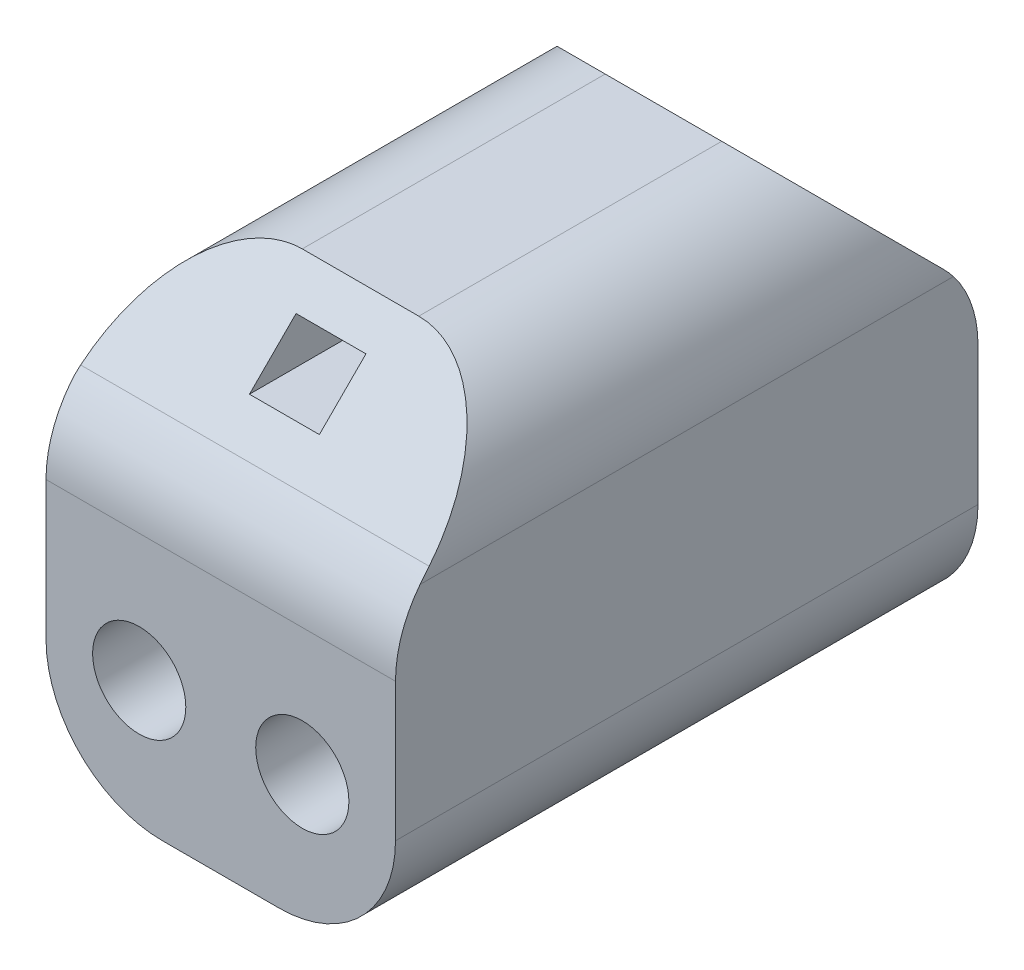
ISO-10303-21;
HEADER;
FILE_DESCRIPTION(('STEP AP214'),'2;1');
FILE_NAME('part.step','',(''),(''),'','','');
FILE_SCHEMA(('AUTOMOTIVE_DESIGN { 1 0 10303 214 1 1 1 1 }'));
ENDSEC;
DATA;
#1=APPLICATION_CONTEXT('core data for automotive mechanical design processes');
#2=APPLICATION_PROTOCOL_DEFINITION('international standard','automotive_design',2000,#1);
#3=PRODUCT_CONTEXT('',#1,'mechanical');
#4=PRODUCT('Part','Part','',(#3));
#5=PRODUCT_RELATED_PRODUCT_CATEGORY('part','',(#4));
#6=PRODUCT_DEFINITION_FORMATION('','',#4);
#7=PRODUCT_DEFINITION_CONTEXT('part definition',#1,'design');
#8=PRODUCT_DEFINITION('design','',#6,#7);
#9=PRODUCT_DEFINITION_SHAPE('','',#8);
#10=(LENGTH_UNIT() NAMED_UNIT(*) SI_UNIT(.MILLI.,.METRE.));
#11=(NAMED_UNIT(*) PLANE_ANGLE_UNIT() SI_UNIT($,.RADIAN.));
#12=(NAMED_UNIT(*) SI_UNIT($,.STERADIAN.) SOLID_ANGLE_UNIT());
#13=UNCERTAINTY_MEASURE_WITH_UNIT(LENGTH_MEASURE(1.E-05),#10,'distance_accuracy_value','');
#14=(GEOMETRIC_REPRESENTATION_CONTEXT(3) GLOBAL_UNCERTAINTY_ASSIGNED_CONTEXT((#13)) GLOBAL_UNIT_ASSIGNED_CONTEXT((#10,
#11,#12)) REPRESENTATION_CONTEXT('',''));
#15=CARTESIAN_POINT('',(0.,0.,0.));
#16=DIRECTION('',(0.,0.,1.));
#17=DIRECTION('',(1.,0.,0.));
#18=AXIS2_PLACEMENT_3D('',#15,#16,#17);
#19=CARTESIAN_POINT('',(7.5,-10.2167347703134,18.3243699615133));
#20=DIRECTION('',(0.,-1.,0.));
#21=DIRECTION('',(0.,0.,-1.));
#22=AXIS2_PLACEMENT_3D('',#19,#20,#21);
#23=PLANE('',#22);
#24=DIRECTION('',(-1.,0.,0.));
#25=VECTOR('',#24,1.);
#26=CARTESIAN_POINT('',(7.5,-10.2167347703134,31.3243699615132));
#27=LINE('',#26,#25);
#28=CARTESIAN_POINT('',(2.5,-10.2167347703134,31.3243699615132));
#29=VERTEX_POINT('',#28);
#30=CARTESIAN_POINT('',(-2.5,-10.2167347703134,31.3243699615132));
#31=VERTEX_POINT('',#30);
#32=EDGE_CURVE('E297',#29,#31,#27,.T.);
#33=ORIENTED_EDGE('',*,*,#32,.F.);
#34=DIRECTION('',(0.,0.,1.));
#35=VECTOR('',#34,1.);
#36=CARTESIAN_POINT('',(2.5,-10.2167347703134,18.3243699615133));
#37=LINE('',#36,#35);
#38=CARTESIAN_POINT('',(2.5,-10.2167347703134,18.3243699615133));
#39=VERTEX_POINT('',#38);
#40=EDGE_CURVE('E303',#29,#39,#37,.F.);
#41=ORIENTED_EDGE('',*,*,#40,.T.);
#42=DIRECTION('',(-1.,0.,0.));
#43=VECTOR('',#42,1.);
#44=CARTESIAN_POINT('',(7.5,-10.2167347703134,18.3243699615133));
#45=LINE('',#44,#43);
#46=CARTESIAN_POINT('',(-2.5,-10.2167347703134,18.3243699615133));
#47=VERTEX_POINT('',#46);
#48=EDGE_CURVE('E327',#39,#47,#45,.T.);
#49=ORIENTED_EDGE('',*,*,#48,.T.);
#50=DIRECTION('',(0.,0.,1.));
#51=VECTOR('',#50,1.);
#52=CARTESIAN_POINT('',(-2.5,-10.2167347703134,18.3243699615133));
#53=LINE('',#52,#51);
#54=EDGE_CURVE('E306',#47,#31,#53,.T.);
#55=ORIENTED_EDGE('',*,*,#54,.T.);
#56=EDGE_LOOP('',(#33,#41,#49,#55));
#57=FACE_BOUND('',#56,.T.);
#58=ADVANCED_FACE('F42',(#57),#23,.F.);
#59=CARTESIAN_POINT('',(7.5,-10.2167347703134,31.3243699615132));
#60=DIRECTION('',(0.,-0.707106781186552,-0.707106781186543));
#61=DIRECTION('',(0.,0.707106781186543,-0.707106781186552));
#62=AXIS2_PLACEMENT_3D('',#59,#60,#61);
#63=PLANE('',#62);
#64=DIRECTION('',(1.,0.,0.));
#65=VECTOR('',#64,1.);
#66=CARTESIAN_POINT('',(7.5,-11.4845017232798,32.5921369144796));
#67=LINE('',#66,#65);
#68=CARTESIAN_POINT('',(-1.5,-11.4845017232798,32.5921369144796));
#69=VERTEX_POINT('',#68);
#70=CARTESIAN_POINT('',(1.5,-11.4845017232798,32.5921369144796));
#71=VERTEX_POINT('',#70);
#72=EDGE_CURVE('E185',#69,#71,#67,.T.);
#73=ORIENTED_EDGE('',*,*,#72,.T.);
#74=DIRECTION('',(0.,-0.707106781186543,0.707106781186552));
#75=VECTOR('',#74,1.);
#76=CARTESIAN_POINT('',(1.5,-10.2167347703134,31.3243699615132));
#77=LINE('',#76,#75);
#78=CARTESIAN_POINT('',(1.5,-13.4845017232798,34.5921369144796));
#79=VERTEX_POINT('',#78);
#80=EDGE_CURVE('E177',#71,#79,#77,.T.);
#81=ORIENTED_EDGE('',*,*,#80,.T.);
#82=DIRECTION('',(-1.,0.,0.));
#83=VECTOR('',#82,1.);
#84=CARTESIAN_POINT('',(7.5,-13.4845017232798,34.5921369144796));
#85=LINE('',#84,#83);
#86=CARTESIAN_POINT('',(-1.5,-13.4845017232797,34.5921369144796));
#87=VERTEX_POINT('',#86);
#88=EDGE_CURVE('E380',#79,#87,#85,.T.);
#89=ORIENTED_EDGE('',*,*,#88,.T.);
#90=DIRECTION('',(0.,0.707106781186543,-0.707106781186552));
#91=VECTOR('',#90,1.);
#92=CARTESIAN_POINT('',(-1.5,-10.2167347703134,31.3243699615132));
#93=LINE('',#92,#91);
#94=EDGE_CURVE('E365',#87,#69,#93,.T.);
#95=ORIENTED_EDGE('',*,*,#94,.T.);
#96=EDGE_LOOP('',(#73,#81,#89,#95));
#97=FACE_BOUND('',#96,.T.);
#98=DIRECTION('',(-1.,0.,0.));
#99=VECTOR('',#98,1.);
#100=CARTESIAN_POINT('',(7.5,-14.7522686762461,35.859903867446));
#101=LINE('',#100,#99);
#102=CARTESIAN_POINT('',(-7.47838038396644,-14.7522686762461,35.859903867446));
#103=VERTEX_POINT('',#102);
#104=CARTESIAN_POINT('',(7.47838038396645,-14.7522686762461,35.859903867446));
#105=VERTEX_POINT('',#104);
#106=EDGE_CURVE('E347',#103,#105,#101,.F.);
#107=ORIENTED_EDGE('',*,*,#106,.T.);
#108=CARTESIAN_POINT('',(2.5,-15.2167347703134,36.3243699615132));
#109=DIRECTION('',(0.,-0.707106781186552,-0.707106781186543));
#110=DIRECTION('',(0.,0.707106781186543,-0.707106781186552));
#111=AXIS2_PLACEMENT_3D('',#108,#109,#110);
#112=ELLIPSE('',#111,7.07106781186552,5.);
#113=EDGE_CURVE('E313',#105,#29,#112,.F.);
#114=ORIENTED_EDGE('',*,*,#113,.T.);
#115=ORIENTED_EDGE('',*,*,#32,.T.);
#116=CARTESIAN_POINT('',(-2.5,-15.2167347703134,36.3243699615132));
#117=DIRECTION('',(0.,-0.707106781186552,-0.707106781186543));
#118=DIRECTION('',(0.,-0.707106781186543,0.707106781186552));
#119=AXIS2_PLACEMENT_3D('',#116,#117,#118);
#120=ELLIPSE('',#119,7.07106781186552,5.);
#121=EDGE_CURVE('E417',#31,#103,#120,.F.);
#122=ORIENTED_EDGE('',*,*,#121,.T.);
#123=EDGE_LOOP('',(#107,#114,#115,#122));
#124=FACE_BOUND('',#123,.T.);
#125=ADVANCED_FACE('F289',(#97,#124),#63,.F.);
#126=CARTESIAN_POINT('',(7.5,-16.2167347703134,37.3243699615132));
#127=DIRECTION('',(0.,0.,-1.));
#128=DIRECTION('',(-1.,0.,0.));
#129=AXIS2_PLACEMENT_3D('',#126,#127,#128);
#130=PLANE('',#129);
#131=CARTESIAN_POINT('',(3.5,-23.7522686762461,37.3243699615133));
#132=DIRECTION('',(0.,0.,-1.));
#133=DIRECTION('',(-1.,0.,0.));
#134=AXIS2_PLACEMENT_3D('',#131,#132,#133);
#135=CIRCLE('',#134,2.);
#136=CARTESIAN_POINT('',(1.5,-23.7522686762461,37.3243699615133));
#137=VERTEX_POINT('',#136);
#138=EDGE_CURVE('E207',#137,#137,#135,.T.);
#139=ORIENTED_EDGE('',*,*,#138,.T.);
#140=EDGE_LOOP('',(#139));
#141=FACE_BOUND('',#140,.T.);
#142=CARTESIAN_POINT('',(-3.5,-23.7522686762461,37.3243699615133));
#143=DIRECTION('',(0.,0.,-1.));
#144=DIRECTION('',(-1.,0.,0.));
#145=AXIS2_PLACEMENT_3D('',#142,#143,#144);
#146=CIRCLE('',#145,2.);
#147=CARTESIAN_POINT('',(-5.5,-23.7522686762461,37.3243699615133));
#148=VERTEX_POINT('',#147);
#149=EDGE_CURVE('E205',#148,#148,#146,.T.);
#150=ORIENTED_EDGE('',*,*,#149,.T.);
#151=EDGE_LOOP('',(#150));
#152=FACE_BOUND('',#151,.T.);
#153=DIRECTION('',(0.,-1.,0.));
#154=VECTOR('',#153,1.);
#155=CARTESIAN_POINT('',(-7.5,-16.2167347703134,37.3243699615132));
#156=LINE('',#155,#154);
#157=CARTESIAN_POINT('',(-7.5,-18.2878025821789,37.3243699615132));
#158=VERTEX_POINT('',#157);
#159=CARTESIAN_POINT('',(-7.5,-24.2167347703134,37.3243699615132));
#160=VERTEX_POINT('',#159);
#161=EDGE_CURVE('E387',#158,#160,#156,.T.);
#162=ORIENTED_EDGE('',*,*,#161,.T.);
#163=CARTESIAN_POINT('',(-2.5,-24.2167347703134,37.3243699615132));
#164=DIRECTION('',(0.,0.,-1.));
#165=DIRECTION('',(-1.,0.,0.));
#166=AXIS2_PLACEMENT_3D('',#163,#164,#165);
#167=CIRCLE('',#166,5.);
#168=CARTESIAN_POINT('',(-2.5,-29.2167347703134,37.3243699615132));
#169=VERTEX_POINT('',#168);
#170=EDGE_CURVE('E221',#160,#169,#167,.F.);
#171=ORIENTED_EDGE('',*,*,#170,.T.);
#172=DIRECTION('',(-1.,0.,0.));
#173=VECTOR('',#172,1.);
#174=CARTESIAN_POINT('',(7.5,-29.2167347703134,37.3243699615132));
#175=LINE('',#174,#173);
#176=CARTESIAN_POINT('',(2.5,-29.2167347703134,37.3243699615132));
#177=VERTEX_POINT('',#176);
#178=EDGE_CURVE('E309',#177,#169,#175,.T.);
#179=ORIENTED_EDGE('',*,*,#178,.F.);
#180=CARTESIAN_POINT('',(2.5,-24.2167347703134,37.3243699615132));
#181=DIRECTION('',(0.,0.,-1.));
#182=DIRECTION('',(-1.,0.,0.));
#183=AXIS2_PLACEMENT_3D('',#180,#181,#182);
#184=CIRCLE('',#183,5.);
#185=CARTESIAN_POINT('',(7.5,-24.2167347703134,37.3243699615132));
#186=VERTEX_POINT('',#185);
#187=EDGE_CURVE('E219',#177,#186,#184,.F.);
#188=ORIENTED_EDGE('',*,*,#187,.T.);
#189=DIRECTION('',(0.,-1.,0.));
#190=VECTOR('',#189,1.);
#191=CARTESIAN_POINT('',(7.5,-16.2167347703134,37.3243699615132));
#192=LINE('',#191,#190);
#193=CARTESIAN_POINT('',(7.5,-18.2878025821789,37.3243699615132));
#194=VERTEX_POINT('',#193);
#195=EDGE_CURVE('E388',#194,#186,#192,.T.);
#196=ORIENTED_EDGE('',*,*,#195,.F.);
#197=DIRECTION('',(-1.,0.,0.));
#198=VECTOR('',#197,1.);
#199=CARTESIAN_POINT('',(7.5,-18.2878025821789,37.3243699615132));
#200=LINE('',#199,#198);
#201=EDGE_CURVE('E307',#194,#158,#200,.T.);
#202=ORIENTED_EDGE('',*,*,#201,.T.);
#203=EDGE_LOOP('',(#162,#171,#179,#188,#196,#202));
#204=FACE_BOUND('',#203,.T.);
#205=ADVANCED_FACE('F294',(#141,#152,#204),#130,.F.);
#206=CARTESIAN_POINT('',(7.5,-29.2167347703134,37.3243699615132));
#207=DIRECTION('',(0.,1.,0.));
#208=DIRECTION('',(0.,0.,1.));
#209=AXIS2_PLACEMENT_3D('',#206,#207,#208);
#210=PLANE('',#209);
#211=ORIENTED_EDGE('',*,*,#178,.T.);
#212=DIRECTION('',(0.,0.,-1.));
#213=VECTOR('',#212,1.);
#214=CARTESIAN_POINT('',(-2.5,-29.2167347703134,37.3243699615132));
#215=LINE('',#214,#213);
#216=CARTESIAN_POINT('',(-2.5,-29.2167347703134,12.3243699615132));
#217=VERTEX_POINT('',#216);
#218=EDGE_CURVE('E192',#169,#217,#215,.T.);
#219=ORIENTED_EDGE('',*,*,#218,.T.);
#220=DIRECTION('',(-1.,0.,0.));
#221=VECTOR('',#220,1.);
#222=CARTESIAN_POINT('',(7.5,-29.2167347703134,12.3243699615132));
#223=LINE('',#222,#221);
#224=CARTESIAN_POINT('',(2.5,-29.2167347703134,12.3243699615132));
#225=VERTEX_POINT('',#224);
#226=EDGE_CURVE('E404',#225,#217,#223,.T.);
#227=ORIENTED_EDGE('',*,*,#226,.F.);
#228=DIRECTION('',(0.,0.,-1.));
#229=VECTOR('',#228,1.);
#230=CARTESIAN_POINT('',(2.5,-29.2167347703134,37.3243699615132));
#231=LINE('',#230,#229);
#232=EDGE_CURVE('E186',#225,#177,#231,.F.);
#233=ORIENTED_EDGE('',*,*,#232,.T.);
#234=EDGE_LOOP('',(#211,#219,#227,#233));
#235=FACE_BOUND('',#234,.T.);
#236=ADVANCED_FACE('F484',(#235),#210,.F.);
#237=CARTESIAN_POINT('',(7.5,-29.2167347703134,12.3243699615132));
#238=DIRECTION('',(0.,0.,1.));
#239=DIRECTION('',(1.,0.,0.));
#240=AXIS2_PLACEMENT_3D('',#237,#238,#239);
#241=PLANE('',#240);
#242=CARTESIAN_POINT('',(3.5,-23.7522686762461,12.3243699615132));
#243=DIRECTION('',(0.,0.,1.));
#244=DIRECTION('',(1.,0.,0.));
#245=AXIS2_PLACEMENT_3D('',#242,#243,#244);
#246=CIRCLE('',#245,2.);
#247=CARTESIAN_POINT('',(5.5,-23.7522686762461,12.3243699615132));
#248=VERTEX_POINT('',#247);
#249=EDGE_CURVE('E201',#248,#248,#246,.T.);
#250=ORIENTED_EDGE('',*,*,#249,.T.);
#251=EDGE_LOOP('',(#250));
#252=FACE_BOUND('',#251,.T.);
#253=CARTESIAN_POINT('',(-3.5,-23.7522686762461,12.3243699615132));
#254=DIRECTION('',(0.,0.,1.));
#255=DIRECTION('',(1.,0.,0.));
#256=AXIS2_PLACEMENT_3D('',#253,#254,#255);
#257=CIRCLE('',#256,2.);
#258=CARTESIAN_POINT('',(-1.5,-23.7522686762461,12.3243699615132));
#259=VERTEX_POINT('',#258);
#260=EDGE_CURVE('E198',#259,#259,#257,.T.);
#261=ORIENTED_EDGE('',*,*,#260,.T.);
#262=EDGE_LOOP('',(#261));
#263=FACE_BOUND('',#262,.T.);
#264=ORIENTED_EDGE('',*,*,#226,.T.);
#265=CARTESIAN_POINT('',(-2.5,-24.2167347703134,12.3243699615132));
#266=DIRECTION('',(0.,0.,1.));
#267=DIRECTION('',(1.,0.,0.));
#268=AXIS2_PLACEMENT_3D('',#265,#266,#267);
#269=CIRCLE('',#268,5.);
#270=CARTESIAN_POINT('',(-7.5,-24.2167347703134,12.3243699615132));
#271=VERTEX_POINT('',#270);
#272=EDGE_CURVE('E213',#217,#271,#269,.F.);
#273=ORIENTED_EDGE('',*,*,#272,.T.);
#274=DIRECTION('',(0.,1.,0.));
#275=VECTOR('',#274,1.);
#276=CARTESIAN_POINT('',(-7.5,-29.2167347703134,12.3243699615132));
#277=LINE('',#276,#275);
#278=CARTESIAN_POINT('',(-7.5,-18.2878025821789,12.3243699615132));
#279=VERTEX_POINT('',#278);
#280=EDGE_CURVE('E393',#271,#279,#277,.T.);
#281=ORIENTED_EDGE('',*,*,#280,.T.);
#282=DIRECTION('',(-1.,0.,0.));
#283=VECTOR('',#282,1.);
#284=CARTESIAN_POINT('',(7.5,-18.2878025821789,12.3243699615132));
#285=LINE('',#284,#283);
#286=CARTESIAN_POINT('',(7.5,-18.2878025821789,12.3243699615132));
#287=VERTEX_POINT('',#286);
#288=EDGE_CURVE('E171',#279,#287,#285,.F.);
#289=ORIENTED_EDGE('',*,*,#288,.T.);
#290=DIRECTION('',(0.,1.,0.));
#291=VECTOR('',#290,1.);
#292=CARTESIAN_POINT('',(7.5,-29.2167347703134,12.3243699615132));
#293=LINE('',#292,#291);
#294=CARTESIAN_POINT('',(7.5,-24.2167347703134,12.3243699615132));
#295=VERTEX_POINT('',#294);
#296=EDGE_CURVE('E395',#295,#287,#293,.T.);
#297=ORIENTED_EDGE('',*,*,#296,.F.);
#298=CARTESIAN_POINT('',(2.5,-24.2167347703134,12.3243699615132));
#299=DIRECTION('',(0.,0.,1.));
#300=DIRECTION('',(1.,0.,0.));
#301=AXIS2_PLACEMENT_3D('',#298,#299,#300);
#302=CIRCLE('',#301,5.);
#303=EDGE_CURVE('E211',#295,#225,#302,.F.);
#304=ORIENTED_EDGE('',*,*,#303,.T.);
#305=EDGE_LOOP('',(#264,#273,#281,#289,#297,#304));
#306=FACE_BOUND('',#305,.T.);
#307=ADVANCED_FACE('F462',(#252,#263,#306),#241,.F.);
#308=CARTESIAN_POINT('',(7.5,-16.2167347703134,12.3243699615132));
#309=DIRECTION('',(0.,-0.707106781186552,0.707106781186543));
#310=DIRECTION('',(0.,-0.707106781186543,-0.707106781186552));
#311=AXIS2_PLACEMENT_3D('',#308,#309,#310);
#312=PLANE('',#311);
#313=DIRECTION('',(1.,0.,0.));
#314=VECTOR('',#313,1.);
#315=CARTESIAN_POINT('',(7.5,-13.4845017232798,15.0566030085469));
#316=LINE('',#315,#314);
#317=CARTESIAN_POINT('',(-1.5,-13.4845017232798,15.0566030085469));
#318=VERTEX_POINT('',#317);
#319=CARTESIAN_POINT('',(1.5,-13.4845017232798,15.0566030085469));
#320=VERTEX_POINT('',#319);
#321=EDGE_CURVE('E190',#318,#320,#316,.T.);
#322=ORIENTED_EDGE('',*,*,#321,.T.);
#323=DIRECTION('',(0.,0.707106781186543,0.707106781186552));
#324=VECTOR('',#323,1.);
#325=CARTESIAN_POINT('',(1.5,-16.2167347703134,12.3243699615132));
#326=LINE('',#325,#324);
#327=CARTESIAN_POINT('',(1.5,-11.4845017232798,17.0566030085469));
#328=VERTEX_POINT('',#327);
#329=EDGE_CURVE('E176',#320,#328,#326,.T.);
#330=ORIENTED_EDGE('',*,*,#329,.T.);
#331=DIRECTION('',(-1.,0.,0.));
#332=VECTOR('',#331,1.);
#333=CARTESIAN_POINT('',(7.5,-11.4845017232798,17.0566030085469));
#334=LINE('',#333,#332);
#335=CARTESIAN_POINT('',(-1.5,-11.4845017232798,17.0566030085469));
#336=VERTEX_POINT('',#335);
#337=EDGE_CURVE('E156',#328,#336,#334,.T.);
#338=ORIENTED_EDGE('',*,*,#337,.T.);
#339=DIRECTION('',(0.,-0.707106781186543,-0.707106781186552));
#340=VECTOR('',#339,1.);
#341=CARTESIAN_POINT('',(-1.5,-16.2167347703134,12.3243699615132));
#342=LINE('',#341,#340);
#343=EDGE_CURVE('E167',#336,#318,#342,.T.);
#344=ORIENTED_EDGE('',*,*,#343,.T.);
#345=EDGE_LOOP('',(#322,#330,#338,#344));
#346=FACE_BOUND('',#345,.T.);
#347=ORIENTED_EDGE('',*,*,#48,.F.);
#348=CARTESIAN_POINT('',(2.5,-15.2167347703134,13.3243699615133));
#349=DIRECTION('',(0.,-0.707106781186552,0.707106781186543));
#350=DIRECTION('',(0.,-0.707106781186543,-0.707106781186552));
#351=AXIS2_PLACEMENT_3D('',#348,#349,#350);
#352=ELLIPSE('',#351,7.07106781186552,5.);
#353=CARTESIAN_POINT('',(7.47838038396645,-14.7522686762461,13.7888360555805));
#354=VERTEX_POINT('',#353);
#355=EDGE_CURVE('E317',#39,#354,#352,.F.);
#356=ORIENTED_EDGE('',*,*,#355,.T.);
#357=DIRECTION('',(-1.,0.,0.));
#358=VECTOR('',#357,1.);
#359=CARTESIAN_POINT('',(7.5,-14.7522686762461,13.7888360555805));
#360=LINE('',#359,#358);
#361=CARTESIAN_POINT('',(-7.47838038396644,-14.7522686762461,13.7888360555805));
#362=VERTEX_POINT('',#361);
#363=EDGE_CURVE('E330',#354,#362,#360,.T.);
#364=ORIENTED_EDGE('',*,*,#363,.T.);
#365=CARTESIAN_POINT('',(-2.5,-15.2167347703134,13.3243699615133));
#366=DIRECTION('',(0.,-0.707106781186552,0.707106781186543));
#367=DIRECTION('',(0.,0.707106781186543,0.707106781186552));
#368=AXIS2_PLACEMENT_3D('',#365,#366,#367);
#369=ELLIPSE('',#368,7.07106781186552,5.);
#370=EDGE_CURVE('E319',#362,#47,#369,.F.);
#371=ORIENTED_EDGE('',*,*,#370,.T.);
#372=EDGE_LOOP('',(#347,#356,#364,#371));
#373=FACE_BOUND('',#372,.T.);
#374=ADVANCED_FACE('F184',(#346,#373),#312,.F.);
#375=CARTESIAN_POINT('',(7.5,0.,0.));
#376=DIRECTION('',(1.,0.,0.));
#377=DIRECTION('',(0.,0.,-1.));
#378=AXIS2_PLACEMENT_3D('',#375,#376,#377);
#379=PLANE('',#378);
#380=CARTESIAN_POINT('',(7.5,-18.2878025821789,17.3243699615132));
#381=DIRECTION('',(1.,0.,0.));
#382=DIRECTION('',(0.,0.,-1.));
#383=AXIS2_PLACEMENT_3D('',#380,#381,#382);
#384=CIRCLE('',#383,5.);
#385=CARTESIAN_POINT('',(7.5,-15.2167347703134,13.3786707212107));
#386=VERTEX_POINT('',#385);
#387=EDGE_CURVE('E341',#287,#386,#384,.T.);
#388=ORIENTED_EDGE('',*,*,#387,.T.);
#389=DIRECTION('',(0.,0.,1.));
#390=VECTOR('',#389,1.);
#391=CARTESIAN_POINT('',(7.5,-15.2167347703134,31.3243699615132));
#392=LINE('',#391,#390);
#393=CARTESIAN_POINT('',(7.5,-15.2167347703134,36.2700692018157));
#394=VERTEX_POINT('',#393);
#395=EDGE_CURVE('E229',#386,#394,#392,.T.);
#396=ORIENTED_EDGE('',*,*,#395,.T.);
#397=CARTESIAN_POINT('',(7.5,-18.2878025821789,32.3243699615132));
#398=DIRECTION('',(1.,0.,0.));
#399=DIRECTION('',(0.,0.,-1.));
#400=AXIS2_PLACEMENT_3D('',#397,#398,#399);
#401=CIRCLE('',#400,5.);
#402=EDGE_CURVE('E331',#394,#194,#401,.T.);
#403=ORIENTED_EDGE('',*,*,#402,.T.);
#404=ORIENTED_EDGE('',*,*,#195,.T.);
#405=DIRECTION('',(0.,0.,-1.));
#406=VECTOR('',#405,1.);
#407=CARTESIAN_POINT('',(7.5,-24.2167347703134,12.3243699615132));
#408=LINE('',#407,#406);
#409=EDGE_CURVE('E228',#186,#295,#408,.T.);
#410=ORIENTED_EDGE('',*,*,#409,.T.);
#411=ORIENTED_EDGE('',*,*,#296,.T.);
#412=EDGE_LOOP('',(#388,#396,#403,#404,#410,#411));
#413=FACE_BOUND('',#412,.T.);
#414=ADVANCED_FACE('F336',(#413),#379,.T.);
#415=CARTESIAN_POINT('',(-7.5,0.,0.));
#416=DIRECTION('',(1.,0.,0.));
#417=DIRECTION('',(0.,0.,-1.));
#418=AXIS2_PLACEMENT_3D('',#415,#416,#417);
#419=PLANE('',#418);
#420=CARTESIAN_POINT('',(-7.5,-18.2878025821789,32.3243699615132));
#421=DIRECTION('',(1.,0.,0.));
#422=DIRECTION('',(0.,0.,-1.));
#423=AXIS2_PLACEMENT_3D('',#420,#421,#422);
#424=CIRCLE('',#423,5.);
#425=CARTESIAN_POINT('',(-7.5,-15.2167347703134,36.2700692018157));
#426=VERTEX_POINT('',#425);
#427=EDGE_CURVE('E418',#158,#426,#424,.F.);
#428=ORIENTED_EDGE('',*,*,#427,.T.);
#429=DIRECTION('',(0.,0.,1.));
#430=VECTOR('',#429,1.);
#431=CARTESIAN_POINT('',(-7.5,-15.2167347703134,0.));
#432=LINE('',#431,#430);
#433=CARTESIAN_POINT('',(-7.5,-15.2167347703134,13.3786707212107));
#434=VERTEX_POINT('',#433);
#435=EDGE_CURVE('E11',#426,#434,#432,.F.);
#436=ORIENTED_EDGE('',*,*,#435,.T.);
#437=CARTESIAN_POINT('',(-7.5,-18.2878025821789,17.3243699615132));
#438=DIRECTION('',(1.,0.,0.));
#439=DIRECTION('',(0.,0.,-1.));
#440=AXIS2_PLACEMENT_3D('',#437,#438,#439);
#441=CIRCLE('',#440,5.);
#442=EDGE_CURVE('E413',#434,#279,#441,.F.);
#443=ORIENTED_EDGE('',*,*,#442,.T.);
#444=ORIENTED_EDGE('',*,*,#280,.F.);
#445=DIRECTION('',(0.,0.,-1.));
#446=VECTOR('',#445,1.);
#447=CARTESIAN_POINT('',(-7.5,-24.2167347703134,0.));
#448=LINE('',#447,#446);
#449=EDGE_CURVE('E220',#271,#160,#448,.F.);
#450=ORIENTED_EDGE('',*,*,#449,.T.);
#451=ORIENTED_EDGE('',*,*,#161,.F.);
#452=EDGE_LOOP('',(#428,#436,#443,#444,#450,#451));
#453=FACE_BOUND('',#452,.T.);
#454=ADVANCED_FACE('F251',(#453),#419,.F.);
#455=CARTESIAN_POINT('',(7.5,-18.2878025821789,32.3243699615132));
#456=DIRECTION('',(-1.,0.,0.));
#457=DIRECTION('',(0.,0.,1.));
#458=AXIS2_PLACEMENT_3D('',#455,#456,#457);
#459=CYLINDRICAL_SURFACE('',#458,5.);
#460=ORIENTED_EDGE('',*,*,#402,.F.);
#461=CARTESIAN_POINT('',(7.5,-15.2167347703134,36.2700692018157));
#462=CARTESIAN_POINT('',(7.50000022228035,-15.1759009062012,36.2382875819391));
#463=CARTESIAN_POINT('',(7.49949979039581,-15.135562259342,36.2058721017981));
#464=CARTESIAN_POINT('',(7.49757314974649,-15.0559720970149,36.1398568381183));
#465=CARTESIAN_POINT('',(7.49614808047301,-15.0167193053733,36.1062585603531));
#466=CARTESIAN_POINT('',(7.49244735306524,-14.9392973421894,36.0378831443199));
#467=CARTESIAN_POINT('',(7.49017170544814,-14.9011281572548,36.0031060206328));
#468=CARTESIAN_POINT('',(7.48484176544979,-14.8258668557712,35.9323711010083));
#469=CARTESIAN_POINT('',(7.48178651759004,-14.7887761235624,35.8964119037751));
#470=CARTESIAN_POINT('',(7.47838038396645,-14.7522686762461,35.859903867446));
#471=B_SPLINE_CURVE_WITH_KNOTS('',3,(#461,#462,#463,#464,#465,#466,#467,#468,#469,#470),
.UNSPECIFIED.,.F.,.F.,(4,2,2,2,4),(0.,0.155222217477744,0.310253506834467,0.46528287932795,
0.620503176248766),.UNSPECIFIED.);
#472=EDGE_CURVE('E245',#394,#105,#471,.T.);
#473=ORIENTED_EDGE('',*,*,#472,.T.);
#474=ORIENTED_EDGE('',*,*,#106,.F.);
#475=CARTESIAN_POINT('',(-7.47838038396644,-14.7522686762461,35.859903867446));
#476=CARTESIAN_POINT('',(-7.48178651759004,-14.7887761235624,35.8964119037751));
#477=CARTESIAN_POINT('',(-7.48484176544979,-14.8258668557712,35.9323711010083));
#478=CARTESIAN_POINT('',(-7.49017170544814,-14.9011281572548,36.0031060206328));
#479=CARTESIAN_POINT('',(-7.49244735306523,-14.9392973421894,36.0378831443199));
#480=CARTESIAN_POINT('',(-7.49614808047301,-15.0167193053733,36.1062585603531));
#481=CARTESIAN_POINT('',(-7.49757314974649,-15.0559720970149,36.1398568381183));
#482=CARTESIAN_POINT('',(-7.4994997903958,-15.135562259342,36.2058721017981));
#483=CARTESIAN_POINT('',(-7.50000022228035,-15.1759009062012,36.2382875819391));
#484=CARTESIAN_POINT('',(-7.5,-15.2167347703134,36.2700692018157));
#485=B_SPLINE_CURVE_WITH_KNOTS('',3,(#475,#476,#477,#478,#479,#480,#481,#482,#483,#484),
.UNSPECIFIED.,.F.,.F.,(4,2,2,2,4),(0.,0.155220296920817,0.3102496694143,0.465280958771023,
0.620503176248769),.UNSPECIFIED.);
#486=EDGE_CURVE('E234',#103,#426,#485,.T.);
#487=ORIENTED_EDGE('',*,*,#486,.T.);
#488=ORIENTED_EDGE('',*,*,#427,.F.);
#489=ORIENTED_EDGE('',*,*,#201,.F.);
#490=EDGE_LOOP('',(#460,#473,#474,#487,#488,#489));
#491=FACE_BOUND('',#490,.T.);
#492=ADVANCED_FACE('F247',(#491),#459,.T.);
#493=CARTESIAN_POINT('',(7.5,-18.2878025821789,17.3243699615132));
#494=DIRECTION('',(-1.,0.,0.));
#495=DIRECTION('',(0.,0.,1.));
#496=AXIS2_PLACEMENT_3D('',#493,#494,#495);
#497=CYLINDRICAL_SURFACE('',#496,5.);
#498=ORIENTED_EDGE('',*,*,#363,.F.);
#499=CARTESIAN_POINT('',(7.47838038396645,-14.7522686762461,13.7888360555805));
#500=CARTESIAN_POINT('',(7.48178651759004,-14.7887761235624,13.7523280192514));
#501=CARTESIAN_POINT('',(7.48484176544979,-14.8258668557712,13.7163688220182));
#502=CARTESIAN_POINT('',(7.49017170544814,-14.9011281572548,13.6456339023937));
#503=CARTESIAN_POINT('',(7.49244735306524,-14.9392973421894,13.6108567787066));
#504=CARTESIAN_POINT('',(7.49614808047301,-15.0167193053733,13.5424813626734));
#505=CARTESIAN_POINT('',(7.49757314974649,-15.0559720970149,13.5088830849081));
#506=CARTESIAN_POINT('',(7.4994997903958,-15.135562259342,13.4428678212284));
#507=CARTESIAN_POINT('',(7.50000022228035,-15.1759009062012,13.4104523410874));
#508=CARTESIAN_POINT('',(7.5,-15.2167347703134,13.3786707212107));
#509=B_SPLINE_CURVE_WITH_KNOTS('',3,(#499,#500,#501,#502,#503,#504,#505,#506,#507,#508),
.UNSPECIFIED.,.F.,.F.,(4,2,2,2,4),(0.,0.155220296920818,0.3102496694143,0.465280958771033,
0.620503176248774),.UNSPECIFIED.);
#510=EDGE_CURVE('E53',#354,#386,#509,.T.);
#511=ORIENTED_EDGE('',*,*,#510,.T.);
#512=ORIENTED_EDGE('',*,*,#387,.F.);
#513=ORIENTED_EDGE('',*,*,#288,.F.);
#514=ORIENTED_EDGE('',*,*,#442,.F.);
#515=CARTESIAN_POINT('',(-7.5,-15.2167347703134,13.3786707212107));
#516=CARTESIAN_POINT('',(-7.50000022228035,-15.1759009062012,13.4104523410874));
#517=CARTESIAN_POINT('',(-7.4994997903958,-15.135562259342,13.4428678212284));
#518=CARTESIAN_POINT('',(-7.49757314974649,-15.0559720970149,13.5088830849081));
#519=CARTESIAN_POINT('',(-7.49614808047301,-15.0167193053733,13.5424813626734));
#520=CARTESIAN_POINT('',(-7.49244735306523,-14.9392973421894,13.6108567787066));
#521=CARTESIAN_POINT('',(-7.49017170544814,-14.9011281572548,13.6456339023937));
#522=CARTESIAN_POINT('',(-7.48484176544979,-14.8258668557712,13.7163688220182));
#523=CARTESIAN_POINT('',(-7.48178651759004,-14.7887761235624,13.7523280192514));
#524=CARTESIAN_POINT('',(-7.47838038396644,-14.7522686762461,13.7888360555805));
#525=B_SPLINE_CURVE_WITH_KNOTS('',3,(#515,#516,#517,#518,#519,#520,#521,#522,#523,#524),
.UNSPECIFIED.,.F.,.F.,(4,2,2,2,4),(0.,0.155222217477744,0.310253506834474,0.465282879327954,
0.620503176248772),.UNSPECIFIED.);
#526=EDGE_CURVE('E66',#434,#362,#525,.T.);
#527=ORIENTED_EDGE('',*,*,#526,.T.);
#528=EDGE_LOOP('',(#498,#511,#512,#513,#514,#527));
#529=FACE_BOUND('',#528,.T.);
#530=ADVANCED_FACE('F254',(#529),#497,.T.);
#531=CARTESIAN_POINT('',(1.5,-11.4845017232798,-100.));
#532=DIRECTION('',(1.,0.,0.));
#533=DIRECTION('',(0.,1.,0.));
#534=AXIS2_PLACEMENT_3D('',#531,#532,#533);
#535=PLANE('',#534);
#536=DIRECTION('',(0.,0.,1.));
#537=VECTOR('',#536,1.);
#538=CARTESIAN_POINT('',(1.5,-11.4845017232798,-100.));
#539=LINE('',#538,#537);
#540=EDGE_CURVE('E163',#328,#71,#539,.T.);
#541=ORIENTED_EDGE('',*,*,#540,.F.);
#542=ORIENTED_EDGE('',*,*,#329,.F.);
#543=DIRECTION('',(0.,0.,1.));
#544=VECTOR('',#543,1.);
#545=CARTESIAN_POINT('',(1.5,-13.4845017232798,-100.));
#546=LINE('',#545,#544);
#547=EDGE_CURVE('E366',#320,#79,#546,.T.);
#548=ORIENTED_EDGE('',*,*,#547,.T.);
#549=ORIENTED_EDGE('',*,*,#80,.F.);
#550=EDGE_LOOP('',(#541,#542,#548,#549));
#551=FACE_BOUND('',#550,.T.);
#552=ADVANCED_FACE('F172',(#551),#535,.F.);
#553=CARTESIAN_POINT('',(-1.5,-13.4845017232798,-100.));
#554=DIRECTION('',(0.,-1.,0.));
#555=DIRECTION('',(0.,0.,-1.));
#556=AXIS2_PLACEMENT_3D('',#553,#554,#555);
#557=PLANE('',#556);
#558=ORIENTED_EDGE('',*,*,#547,.F.);
#559=ORIENTED_EDGE('',*,*,#321,.F.);
#560=DIRECTION('',(0.,0.,1.));
#561=VECTOR('',#560,1.);
#562=CARTESIAN_POINT('',(-1.5,-13.4845017232798,-100.));
#563=LINE('',#562,#561);
#564=EDGE_CURVE('E363',#318,#87,#563,.T.);
#565=ORIENTED_EDGE('',*,*,#564,.T.);
#566=ORIENTED_EDGE('',*,*,#88,.F.);
#567=EDGE_LOOP('',(#558,#559,#565,#566));
#568=FACE_BOUND('',#567,.T.);
#569=ADVANCED_FACE('F553',(#568),#557,.F.);
#570=CARTESIAN_POINT('',(-1.5,-11.4845017232798,-100.));
#571=DIRECTION('',(-1.,0.,0.));
#572=DIRECTION('',(0.,-1.,0.));
#573=AXIS2_PLACEMENT_3D('',#570,#571,#572);
#574=PLANE('',#573);
#575=ORIENTED_EDGE('',*,*,#564,.F.);
#576=ORIENTED_EDGE('',*,*,#343,.F.);
#577=DIRECTION('',(0.,0.,1.));
#578=VECTOR('',#577,1.);
#579=CARTESIAN_POINT('',(-1.5,-11.4845017232798,-100.));
#580=LINE('',#579,#578);
#581=EDGE_CURVE('E165',#336,#69,#580,.T.);
#582=ORIENTED_EDGE('',*,*,#581,.T.);
#583=ORIENTED_EDGE('',*,*,#94,.F.);
#584=EDGE_LOOP('',(#575,#576,#582,#583));
#585=FACE_BOUND('',#584,.T.);
#586=ADVANCED_FACE('F356',(#585),#574,.F.);
#587=CARTESIAN_POINT('',(-1.5,-11.4845017232798,-100.));
#588=DIRECTION('',(0.,1.,0.));
#589=DIRECTION('',(0.,0.,1.));
#590=AXIS2_PLACEMENT_3D('',#587,#588,#589);
#591=PLANE('',#590);
#592=ORIENTED_EDGE('',*,*,#581,.F.);
#593=ORIENTED_EDGE('',*,*,#337,.F.);
#594=ORIENTED_EDGE('',*,*,#540,.T.);
#595=ORIENTED_EDGE('',*,*,#72,.F.);
#596=EDGE_LOOP('',(#592,#593,#594,#595));
#597=FACE_BOUND('',#596,.T.);
#598=ADVANCED_FACE('F159',(#597),#591,.F.);
#599=CARTESIAN_POINT('',(-3.5,-23.7522686762461,-100.));
#600=DIRECTION('',(0.,0.,1.));
#601=DIRECTION('',(1.,0.,0.));
#602=AXIS2_PLACEMENT_3D('',#599,#600,#601);
#603=CYLINDRICAL_SURFACE('',#602,2.);
#604=ORIENTED_EDGE('',*,*,#260,.F.);
#605=EDGE_LOOP('',(#604));
#606=FACE_BOUND('',#605,.T.);
#607=ORIENTED_EDGE('',*,*,#149,.F.);
#608=EDGE_LOOP('',(#607));
#609=FACE_BOUND('',#608,.T.);
#610=ADVANCED_FACE('F522',(#606,#609),#603,.F.);
#611=CARTESIAN_POINT('',(3.5,-23.7522686762461,-100.));
#612=DIRECTION('',(0.,0.,1.));
#613=DIRECTION('',(1.,0.,0.));
#614=AXIS2_PLACEMENT_3D('',#611,#612,#613);
#615=CYLINDRICAL_SURFACE('',#614,2.);
#616=ORIENTED_EDGE('',*,*,#249,.F.);
#617=EDGE_LOOP('',(#616));
#618=FACE_BOUND('',#617,.T.);
#619=ORIENTED_EDGE('',*,*,#138,.F.);
#620=EDGE_LOOP('',(#619));
#621=FACE_BOUND('',#620,.T.);
#622=ADVANCED_FACE('F290',(#618,#621),#615,.F.);
#623=CARTESIAN_POINT('',(-2.5,-24.2167347703134,37.3243699615132));
#624=DIRECTION('',(0.,0.,-1.));
#625=DIRECTION('',(-1.,0.,0.));
#626=AXIS2_PLACEMENT_3D('',#623,#624,#625);
#627=CYLINDRICAL_SURFACE('',#626,5.);
#628=ORIENTED_EDGE('',*,*,#170,.F.);
#629=ORIENTED_EDGE('',*,*,#449,.F.);
#630=ORIENTED_EDGE('',*,*,#272,.F.);
#631=ORIENTED_EDGE('',*,*,#218,.F.);
#632=EDGE_LOOP('',(#628,#629,#630,#631));
#633=FACE_BOUND('',#632,.T.);
#634=ADVANCED_FACE('F261',(#633),#627,.T.);
#635=CARTESIAN_POINT('',(2.5,-24.2167347703134,0.));
#636=DIRECTION('',(0.,0.,1.));
#637=DIRECTION('',(1.,0.,0.));
#638=AXIS2_PLACEMENT_3D('',#635,#636,#637);
#639=CYLINDRICAL_SURFACE('',#638,5.);
#640=ORIENTED_EDGE('',*,*,#187,.F.);
#641=ORIENTED_EDGE('',*,*,#232,.F.);
#642=ORIENTED_EDGE('',*,*,#303,.F.);
#643=ORIENTED_EDGE('',*,*,#409,.F.);
#644=EDGE_LOOP('',(#640,#641,#642,#643));
#645=FACE_BOUND('',#644,.T.);
#646=ADVANCED_FACE('F277',(#645),#639,.T.);
#647=CARTESIAN_POINT('',(2.5,-15.2167347703134,0.));
#648=DIRECTION('',(0.,0.,-1.));
#649=DIRECTION('',(0.,1.,0.));
#650=AXIS2_PLACEMENT_3D('',#647,#648,#649);
#651=CYLINDRICAL_SURFACE('',#650,5.);
#652=ORIENTED_EDGE('',*,*,#355,.F.);
#653=ORIENTED_EDGE('',*,*,#40,.F.);
#654=ORIENTED_EDGE('',*,*,#113,.F.);
#655=ORIENTED_EDGE('',*,*,#472,.F.);
#656=ORIENTED_EDGE('',*,*,#395,.F.);
#657=ORIENTED_EDGE('',*,*,#510,.F.);
#658=EDGE_LOOP('',(#652,#653,#654,#655,#656,#657));
#659=FACE_BOUND('',#658,.T.);
#660=ADVANCED_FACE('F273',(#659),#651,.T.);
#661=CARTESIAN_POINT('',(-2.5,-15.2167347703134,18.3243699615133));
#662=DIRECTION('',(0.,0.,1.));
#663=DIRECTION('',(0.,-1.,0.));
#664=AXIS2_PLACEMENT_3D('',#661,#662,#663);
#665=CYLINDRICAL_SURFACE('',#664,5.);
#666=ORIENTED_EDGE('',*,*,#526,.F.);
#667=ORIENTED_EDGE('',*,*,#435,.F.);
#668=ORIENTED_EDGE('',*,*,#486,.F.);
#669=ORIENTED_EDGE('',*,*,#121,.F.);
#670=ORIENTED_EDGE('',*,*,#54,.F.);
#671=ORIENTED_EDGE('',*,*,#370,.F.);
#672=EDGE_LOOP('',(#666,#667,#668,#669,#670,#671));
#673=FACE_BOUND('',#672,.T.);
#674=ADVANCED_FACE('F46',(#673),#665,.T.);
#675=CLOSED_SHELL('',(#58,#125,#205,#236,#307,#374,#414,#454,#492,#530,#552,#569,#586,#598,#610,
#622,#634,#646,#660,#674));
#676=MANIFOLD_SOLID_BREP('B2',#675);
#677=ADVANCED_BREP_SHAPE_REPRESENTATION('',(#18,#676),#14);
#678=SHAPE_DEFINITION_REPRESENTATION(#9,#677);
ENDSEC;
END-ISO-10303-21;
